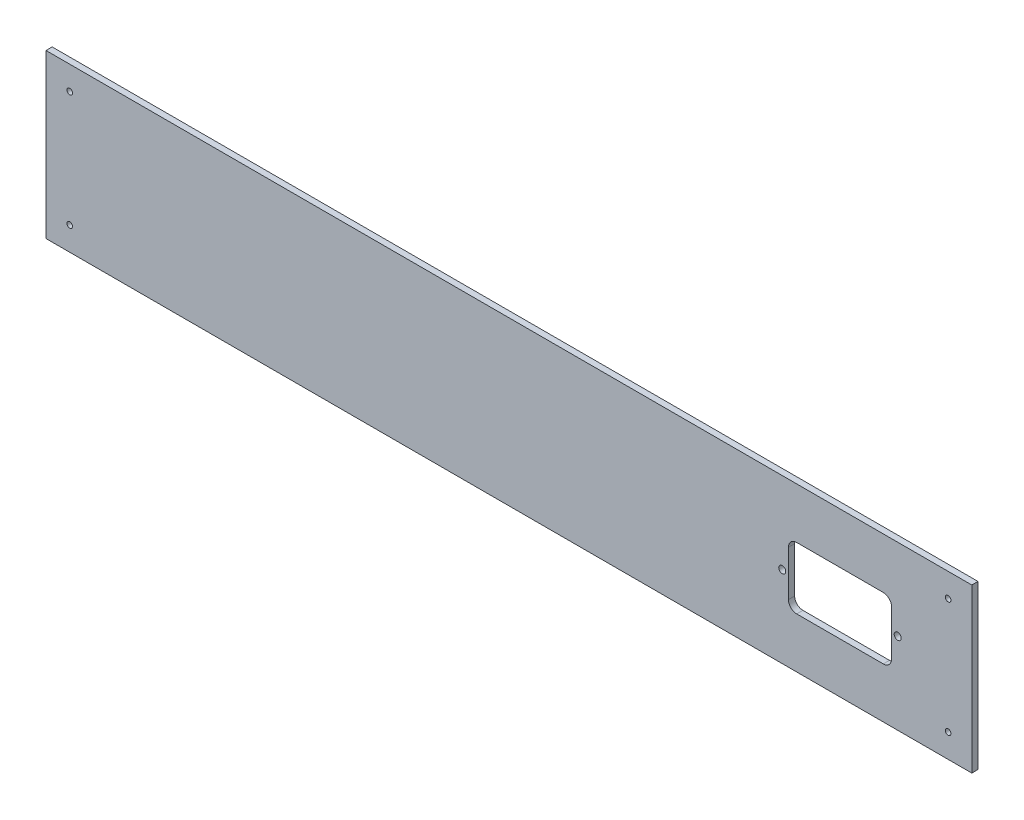
ISO-10303-21;
HEADER;
FILE_DESCRIPTION(('STEP AP214'),'2;1');
FILE_NAME('part.step','',(''),(''),'','','');
FILE_SCHEMA(('AUTOMOTIVE_DESIGN { 1 0 10303 214 1 1 1 1 }'));
ENDSEC;
DATA;
#1=APPLICATION_CONTEXT('core data for automotive mechanical design processes');
#2=APPLICATION_PROTOCOL_DEFINITION('international standard','automotive_design',2000,#1);
#3=PRODUCT_CONTEXT('',#1,'mechanical');
#4=PRODUCT('Part','Part','',(#3));
#5=PRODUCT_RELATED_PRODUCT_CATEGORY('part','',(#4));
#6=PRODUCT_DEFINITION_FORMATION('','',#4);
#7=PRODUCT_DEFINITION_CONTEXT('part definition',#1,'design');
#8=PRODUCT_DEFINITION('design','',#6,#7);
#9=PRODUCT_DEFINITION_SHAPE('','',#8);
#10=(LENGTH_UNIT() NAMED_UNIT(*) SI_UNIT(.MILLI.,.METRE.));
#11=(NAMED_UNIT(*) PLANE_ANGLE_UNIT() SI_UNIT($,.RADIAN.));
#12=(NAMED_UNIT(*) SI_UNIT($,.STERADIAN.) SOLID_ANGLE_UNIT());
#13=UNCERTAINTY_MEASURE_WITH_UNIT(LENGTH_MEASURE(1.E-05),#10,'distance_accuracy_value','');
#14=(GEOMETRIC_REPRESENTATION_CONTEXT(3) GLOBAL_UNCERTAINTY_ASSIGNED_CONTEXT((#13)) GLOBAL_UNIT_ASSIGNED_CONTEXT((#10,
#11,#12)) REPRESENTATION_CONTEXT('',''));
#15=CARTESIAN_POINT('',(0.,0.,0.));
#16=DIRECTION('',(0.,0.,1.));
#17=DIRECTION('',(1.,0.,0.));
#18=AXIS2_PLACEMENT_3D('',#15,#16,#17);
#19=CARTESIAN_POINT('',(0.,0.,3.));
#20=DIRECTION('',(0.,0.,-1.));
#21=DIRECTION('',(-1.,0.,0.));
#22=AXIS2_PLACEMENT_3D('',#19,#20,#21);
#23=PLANE('',#22);
#24=CARTESIAN_POINT('',(357.061242297895,39.5055064167184,3.));
#25=DIRECTION('',(0.,0.,-1.));
#26=DIRECTION('',(-1.,0.,0.));
#27=AXIS2_PLACEMENT_3D('',#24,#25,#26);
#28=CIRCLE('',#27,1.70000000000001);
#29=CARTESIAN_POINT('',(355.361242297895,39.5055064167184,3.));
#30=VERTEX_POINT('',#29);
#31=EDGE_CURVE('E356',#30,#30,#28,.T.);
#32=ORIENTED_EDGE('',*,*,#31,.T.);
#33=EDGE_LOOP('',(#32));
#34=FACE_BOUND('',#33,.T.);
#35=CARTESIAN_POINT('',(413.061242297895,39.5055064167184,3.));
#36=DIRECTION('',(0.,0.,-1.));
#37=DIRECTION('',(-1.,0.,0.));
#38=AXIS2_PLACEMENT_3D('',#35,#36,#37);
#39=CIRCLE('',#38,1.70000000000001);
#40=CARTESIAN_POINT('',(411.361242297895,39.5055064167184,3.));
#41=VERTEX_POINT('',#40);
#42=EDGE_CURVE('E166',#41,#41,#39,.T.);
#43=ORIENTED_EDGE('',*,*,#42,.T.);
#44=EDGE_LOOP('',(#43));
#45=FACE_BOUND('',#44,.T.);
#46=DIRECTION('',(0.,1.,0.));
#47=VECTOR('',#46,1.);
#48=CARTESIAN_POINT('',(360.074633799863,50.3949202589218,3.));
#49=LINE('',#48,#47);
#50=CARTESIAN_POINT('',(360.074633799863,28.3949202589218,3.));
#51=VERTEX_POINT('',#50);
#52=CARTESIAN_POINT('',(360.074633799863,50.3949202589218,3.));
#53=VERTEX_POINT('',#52);
#54=EDGE_CURVE('E132',#51,#53,#49,.T.);
#55=ORIENTED_EDGE('',*,*,#54,.T.);
#56=CARTESIAN_POINT('',(364.074633799863,50.3949202589218,3.));
#57=DIRECTION('',(0.,0.,-1.));
#58=DIRECTION('',(-1.,0.,0.));
#59=AXIS2_PLACEMENT_3D('',#56,#57,#58);
#60=CIRCLE('',#59,4.);
#61=CARTESIAN_POINT('',(364.074633799863,54.3949202589218,3.));
#62=VERTEX_POINT('',#61);
#63=EDGE_CURVE('E126',#53,#62,#60,.T.);
#64=ORIENTED_EDGE('',*,*,#63,.T.);
#65=DIRECTION('',(1.,0.,0.));
#66=VECTOR('',#65,1.);
#67=CARTESIAN_POINT('',(364.074633799863,54.3949202589218,3.));
#68=LINE('',#67,#66);
#69=CARTESIAN_POINT('',(406.074633799864,54.3949202589218,3.));
#70=VERTEX_POINT('',#69);
#71=EDGE_CURVE('E135',#62,#70,#68,.T.);
#72=ORIENTED_EDGE('',*,*,#71,.T.);
#73=CARTESIAN_POINT('',(406.074633799864,50.3949202589218,3.));
#74=DIRECTION('',(0.,0.,-1.));
#75=DIRECTION('',(1.,0.,0.));
#76=AXIS2_PLACEMENT_3D('',#73,#74,#75);
#77=CIRCLE('',#76,4.);
#78=CARTESIAN_POINT('',(410.074633799864,50.3949202589218,3.));
#79=VERTEX_POINT('',#78);
#80=EDGE_CURVE('E50',#70,#79,#77,.T.);
#81=ORIENTED_EDGE('',*,*,#80,.T.);
#82=DIRECTION('',(0.,-1.,0.));
#83=VECTOR('',#82,1.);
#84=CARTESIAN_POINT('',(410.074633799864,50.3949202589218,3.));
#85=LINE('',#84,#83);
#86=CARTESIAN_POINT('',(410.074633799864,28.3949202589218,3.));
#87=VERTEX_POINT('',#86);
#88=EDGE_CURVE('E152',#79,#87,#85,.T.);
#89=ORIENTED_EDGE('',*,*,#88,.T.);
#90=CARTESIAN_POINT('',(406.074633799864,28.3949202589218,3.));
#91=DIRECTION('',(0.,0.,-1.));
#92=DIRECTION('',(1.,0.,0.));
#93=AXIS2_PLACEMENT_3D('',#90,#91,#92);
#94=CIRCLE('',#93,4.);
#95=CARTESIAN_POINT('',(406.074633799864,24.3949202589218,3.));
#96=VERTEX_POINT('',#95);
#97=EDGE_CURVE('E155',#87,#96,#94,.T.);
#98=ORIENTED_EDGE('',*,*,#97,.T.);
#99=DIRECTION('',(-1.,0.,0.));
#100=VECTOR('',#99,1.);
#101=CARTESIAN_POINT('',(364.074633799863,24.3949202589218,3.));
#102=LINE('',#101,#100);
#103=CARTESIAN_POINT('',(364.074633799863,24.3949202589218,3.));
#104=VERTEX_POINT('',#103);
#105=EDGE_CURVE('E158',#96,#104,#102,.T.);
#106=ORIENTED_EDGE('',*,*,#105,.T.);
#107=CARTESIAN_POINT('',(364.074633799863,28.3949202589218,3.));
#108=DIRECTION('',(0.,0.,-1.));
#109=DIRECTION('',(1.,0.,0.));
#110=AXIS2_PLACEMENT_3D('',#107,#108,#109);
#111=CIRCLE('',#110,4.);
#112=EDGE_CURVE('E161',#104,#51,#111,.T.);
#113=ORIENTED_EDGE('',*,*,#112,.T.);
#114=EDGE_LOOP('',(#55,#64,#72,#81,#89,#98,#106,#113));
#115=FACE_BOUND('',#114,.T.);
#116=DIRECTION('',(1.,0.,0.));
#117=VECTOR('',#116,1.);
#118=CARTESIAN_POINT('',(449.,0.,3.));
#119=LINE('',#118,#117);
#120=CARTESIAN_POINT('',(0.,0.,3.));
#121=VERTEX_POINT('',#120);
#122=CARTESIAN_POINT('',(449.,0.,3.));
#123=VERTEX_POINT('',#122);
#124=EDGE_CURVE('E220',#121,#123,#119,.T.);
#125=ORIENTED_EDGE('',*,*,#124,.T.);
#126=DIRECTION('',(0.,1.,0.));
#127=VECTOR('',#126,1.);
#128=CARTESIAN_POINT('',(449.,79.,3.));
#129=LINE('',#128,#127);
#130=CARTESIAN_POINT('',(449.,79.,3.));
#131=VERTEX_POINT('',#130);
#132=EDGE_CURVE('E223',#123,#131,#129,.T.);
#133=ORIENTED_EDGE('',*,*,#132,.T.);
#134=DIRECTION('',(-1.,0.,0.));
#135=VECTOR('',#134,1.);
#136=CARTESIAN_POINT('',(0.,79.,3.));
#137=LINE('',#136,#135);
#138=CARTESIAN_POINT('',(0.,79.,3.));
#139=VERTEX_POINT('',#138);
#140=EDGE_CURVE('E226',#131,#139,#137,.T.);
#141=ORIENTED_EDGE('',*,*,#140,.T.);
#142=DIRECTION('',(0.,-1.,0.));
#143=VECTOR('',#142,1.);
#144=CARTESIAN_POINT('',(0.,0.,3.));
#145=LINE('',#144,#143);
#146=EDGE_CURVE('E228',#139,#121,#145,.T.);
#147=ORIENTED_EDGE('',*,*,#146,.T.);
#148=EDGE_LOOP('',(#125,#133,#141,#147));
#149=FACE_BOUND('',#148,.T.);
#150=CARTESIAN_POINT('',(11.5,67.5,3.));
#151=DIRECTION('',(0.,0.,1.));
#152=DIRECTION('',(1.,0.,0.));
#153=AXIS2_PLACEMENT_3D('',#150,#151,#152);
#154=CIRCLE('',#153,1.36166781672217);
#155=CARTESIAN_POINT('',(12.8616678167222,67.5,3.));
#156=VERTEX_POINT('',#155);
#157=EDGE_CURVE('E214',#156,#156,#154,.T.);
#158=ORIENTED_EDGE('',*,*,#157,.F.);
#159=EDGE_LOOP('',(#158));
#160=FACE_BOUND('',#159,.T.);
#161=CARTESIAN_POINT('',(437.5,67.5,3.));
#162=DIRECTION('',(0.,0.,1.));
#163=DIRECTION('',(-1.,0.,0.));
#164=AXIS2_PLACEMENT_3D('',#161,#162,#163);
#165=CIRCLE('',#164,1.36166781672212);
#166=CARTESIAN_POINT('',(436.138332183278,67.5,3.));
#167=VERTEX_POINT('',#166);
#168=EDGE_CURVE('E208',#167,#167,#165,.T.);
#169=ORIENTED_EDGE('',*,*,#168,.F.);
#170=EDGE_LOOP('',(#169));
#171=FACE_BOUND('',#170,.T.);
#172=CARTESIAN_POINT('',(11.5,11.5,3.));
#173=DIRECTION('',(0.,0.,1.));
#174=DIRECTION('',(-1.,0.,0.));
#175=AXIS2_PLACEMENT_3D('',#172,#173,#174);
#176=CIRCLE('',#175,1.36166781672217);
#177=CARTESIAN_POINT('',(10.1383321832778,11.5,3.));
#178=VERTEX_POINT('',#177);
#179=EDGE_CURVE('E202',#178,#178,#176,.T.);
#180=ORIENTED_EDGE('',*,*,#179,.F.);
#181=EDGE_LOOP('',(#180));
#182=FACE_BOUND('',#181,.T.);
#183=CARTESIAN_POINT('',(437.5,11.5,3.));
#184=DIRECTION('',(0.,0.,1.));
#185=DIRECTION('',(1.,0.,0.));
#186=AXIS2_PLACEMENT_3D('',#183,#184,#185);
#187=CIRCLE('',#186,1.36166781672212);
#188=CARTESIAN_POINT('',(438.861667816722,11.5,3.));
#189=VERTEX_POINT('',#188);
#190=EDGE_CURVE('E196',#189,#189,#187,.T.);
#191=ORIENTED_EDGE('',*,*,#190,.F.);
#192=EDGE_LOOP('',(#191));
#193=FACE_BOUND('',#192,.T.);
#194=ADVANCED_FACE('F35',(#34,#45,#115,#149,#160,#171,#182,#193),#23,.F.);
#195=CARTESIAN_POINT('',(0.,0.,0.));
#196=DIRECTION('',(0.,0.,-1.));
#197=DIRECTION('',(-1.,0.,0.));
#198=AXIS2_PLACEMENT_3D('',#195,#196,#197);
#199=PLANE('',#198);
#200=CARTESIAN_POINT('',(357.061242297895,39.5055064167184,0.));
#201=DIRECTION('',(0.,0.,-1.));
#202=DIRECTION('',(-1.,0.,0.));
#203=AXIS2_PLACEMENT_3D('',#200,#201,#202);
#204=CIRCLE('',#203,1.70000000000001);
#205=CARTESIAN_POINT('',(355.361242297895,39.5055064167184,0.));
#206=VERTEX_POINT('',#205);
#207=EDGE_CURVE('E359',#206,#206,#204,.T.);
#208=ORIENTED_EDGE('',*,*,#207,.F.);
#209=EDGE_LOOP('',(#208));
#210=FACE_BOUND('',#209,.T.);
#211=CARTESIAN_POINT('',(413.061242297895,39.5055064167184,0.));
#212=DIRECTION('',(0.,0.,-1.));
#213=DIRECTION('',(-1.,0.,0.));
#214=AXIS2_PLACEMENT_3D('',#211,#212,#213);
#215=CIRCLE('',#214,1.70000000000001);
#216=CARTESIAN_POINT('',(411.361242297895,39.5055064167184,0.));
#217=VERTEX_POINT('',#216);
#218=EDGE_CURVE('E148',#217,#217,#215,.T.);
#219=ORIENTED_EDGE('',*,*,#218,.F.);
#220=EDGE_LOOP('',(#219));
#221=FACE_BOUND('',#220,.T.);
#222=CARTESIAN_POINT('',(364.074633799863,50.3949202589218,0.));
#223=DIRECTION('',(0.,0.,-1.));
#224=DIRECTION('',(-1.,0.,0.));
#225=AXIS2_PLACEMENT_3D('',#222,#223,#224);
#226=CIRCLE('',#225,4.);
#227=CARTESIAN_POINT('',(360.074633799863,50.3949202589218,0.));
#228=VERTEX_POINT('',#227);
#229=CARTESIAN_POINT('',(364.074633799863,54.3949202589218,0.));
#230=VERTEX_POINT('',#229);
#231=EDGE_CURVE('E58',#228,#230,#226,.T.);
#232=ORIENTED_EDGE('',*,*,#231,.F.);
#233=DIRECTION('',(0.,1.,0.));
#234=VECTOR('',#233,1.);
#235=CARTESIAN_POINT('',(360.074633799863,50.3949202589218,0.));
#236=LINE('',#235,#234);
#237=CARTESIAN_POINT('',(360.074633799863,28.3949202589218,0.));
#238=VERTEX_POINT('',#237);
#239=EDGE_CURVE('E142',#238,#228,#236,.T.);
#240=ORIENTED_EDGE('',*,*,#239,.F.);
#241=CARTESIAN_POINT('',(364.074633799863,28.3949202589218,0.));
#242=DIRECTION('',(0.,0.,-1.));
#243=DIRECTION('',(1.,0.,0.));
#244=AXIS2_PLACEMENT_3D('',#241,#242,#243);
#245=CIRCLE('',#244,4.);
#246=CARTESIAN_POINT('',(364.074633799863,24.3949202589218,0.));
#247=VERTEX_POINT('',#246);
#248=EDGE_CURVE('E145',#247,#238,#245,.T.);
#249=ORIENTED_EDGE('',*,*,#248,.F.);
#250=DIRECTION('',(-1.,0.,0.));
#251=VECTOR('',#250,1.);
#252=CARTESIAN_POINT('',(364.074633799863,24.3949202589218,0.));
#253=LINE('',#252,#251);
#254=CARTESIAN_POINT('',(406.074633799864,24.3949202589218,0.));
#255=VERTEX_POINT('',#254);
#256=EDGE_CURVE('E177',#255,#247,#253,.T.);
#257=ORIENTED_EDGE('',*,*,#256,.F.);
#258=CARTESIAN_POINT('',(406.074633799864,28.3949202589218,0.));
#259=DIRECTION('',(0.,0.,-1.));
#260=DIRECTION('',(1.,0.,0.));
#261=AXIS2_PLACEMENT_3D('',#258,#259,#260);
#262=CIRCLE('',#261,4.);
#263=CARTESIAN_POINT('',(410.074633799864,28.3949202589218,0.));
#264=VERTEX_POINT('',#263);
#265=EDGE_CURVE('E174',#264,#255,#262,.T.);
#266=ORIENTED_EDGE('',*,*,#265,.F.);
#267=DIRECTION('',(0.,-1.,0.));
#268=VECTOR('',#267,1.);
#269=CARTESIAN_POINT('',(410.074633799864,50.3949202589218,0.));
#270=LINE('',#269,#268);
#271=CARTESIAN_POINT('',(410.074633799864,50.3949202589218,0.));
#272=VERTEX_POINT('',#271);
#273=EDGE_CURVE('E171',#272,#264,#270,.T.);
#274=ORIENTED_EDGE('',*,*,#273,.F.);
#275=CARTESIAN_POINT('',(406.074633799864,50.3949202589218,0.));
#276=DIRECTION('',(0.,0.,-1.));
#277=DIRECTION('',(1.,0.,0.));
#278=AXIS2_PLACEMENT_3D('',#275,#276,#277);
#279=CIRCLE('',#278,4.);
#280=CARTESIAN_POINT('',(406.074633799864,54.3949202589218,0.));
#281=VERTEX_POINT('',#280);
#282=EDGE_CURVE('E168',#281,#272,#279,.T.);
#283=ORIENTED_EDGE('',*,*,#282,.F.);
#284=DIRECTION('',(1.,0.,0.));
#285=VECTOR('',#284,1.);
#286=CARTESIAN_POINT('',(364.074633799863,54.3949202589218,0.));
#287=LINE('',#286,#285);
#288=EDGE_CURVE('E165',#230,#281,#287,.T.);
#289=ORIENTED_EDGE('',*,*,#288,.F.);
#290=EDGE_LOOP('',(#232,#240,#249,#257,#266,#274,#283,#289));
#291=FACE_BOUND('',#290,.T.);
#292=CARTESIAN_POINT('',(11.5,11.5,0.));
#293=DIRECTION('',(0.,0.,1.));
#294=DIRECTION('',(-1.,0.,0.));
#295=AXIS2_PLACEMENT_3D('',#292,#293,#294);
#296=CIRCLE('',#295,1.36166781672217);
#297=CARTESIAN_POINT('',(10.1383321832778,11.5,0.));
#298=VERTEX_POINT('',#297);
#299=EDGE_CURVE('E199',#298,#298,#296,.T.);
#300=ORIENTED_EDGE('',*,*,#299,.T.);
#301=EDGE_LOOP('',(#300));
#302=FACE_BOUND('',#301,.T.);
#303=CARTESIAN_POINT('',(11.5,67.5,0.));
#304=DIRECTION('',(0.,0.,1.));
#305=DIRECTION('',(1.,0.,0.));
#306=AXIS2_PLACEMENT_3D('',#303,#304,#305);
#307=CIRCLE('',#306,1.36166781672217);
#308=CARTESIAN_POINT('',(12.8616678167222,67.5,0.));
#309=VERTEX_POINT('',#308);
#310=EDGE_CURVE('E211',#309,#309,#307,.T.);
#311=ORIENTED_EDGE('',*,*,#310,.T.);
#312=EDGE_LOOP('',(#311));
#313=FACE_BOUND('',#312,.T.);
#314=DIRECTION('',(1.,0.,0.));
#315=VECTOR('',#314,1.);
#316=CARTESIAN_POINT('',(449.,0.,0.));
#317=LINE('',#316,#315);
#318=CARTESIAN_POINT('',(0.,0.,0.));
#319=VERTEX_POINT('',#318);
#320=CARTESIAN_POINT('',(449.,0.,0.));
#321=VERTEX_POINT('',#320);
#322=EDGE_CURVE('E217',#319,#321,#317,.T.);
#323=ORIENTED_EDGE('',*,*,#322,.F.);
#324=DIRECTION('',(0.,-1.,0.));
#325=VECTOR('',#324,1.);
#326=CARTESIAN_POINT('',(0.,0.,0.));
#327=LINE('',#326,#325);
#328=CARTESIAN_POINT('',(0.,79.,0.));
#329=VERTEX_POINT('',#328);
#330=EDGE_CURVE('E224',#329,#319,#327,.T.);
#331=ORIENTED_EDGE('',*,*,#330,.F.);
#332=DIRECTION('',(-1.,0.,0.));
#333=VECTOR('',#332,1.);
#334=CARTESIAN_POINT('',(0.,79.,0.));
#335=LINE('',#334,#333);
#336=CARTESIAN_POINT('',(449.,79.,0.));
#337=VERTEX_POINT('',#336);
#338=EDGE_CURVE('E235',#337,#329,#335,.T.);
#339=ORIENTED_EDGE('',*,*,#338,.F.);
#340=DIRECTION('',(0.,1.,0.));
#341=VECTOR('',#340,1.);
#342=CARTESIAN_POINT('',(449.,79.,0.));
#343=LINE('',#342,#341);
#344=EDGE_CURVE('E233',#321,#337,#343,.T.);
#345=ORIENTED_EDGE('',*,*,#344,.F.);
#346=EDGE_LOOP('',(#323,#331,#339,#345));
#347=FACE_BOUND('',#346,.T.);
#348=CARTESIAN_POINT('',(437.5,67.5,0.));
#349=DIRECTION('',(0.,0.,1.));
#350=DIRECTION('',(-1.,0.,0.));
#351=AXIS2_PLACEMENT_3D('',#348,#349,#350);
#352=CIRCLE('',#351,1.36166781672212);
#353=CARTESIAN_POINT('',(436.138332183278,67.5,0.));
#354=VERTEX_POINT('',#353);
#355=EDGE_CURVE('E205',#354,#354,#352,.T.);
#356=ORIENTED_EDGE('',*,*,#355,.T.);
#357=EDGE_LOOP('',(#356));
#358=FACE_BOUND('',#357,.T.);
#359=CARTESIAN_POINT('',(437.5,11.5,0.));
#360=DIRECTION('',(0.,0.,1.));
#361=DIRECTION('',(1.,0.,0.));
#362=AXIS2_PLACEMENT_3D('',#359,#360,#361);
#363=CIRCLE('',#362,1.36166781672212);
#364=CARTESIAN_POINT('',(438.861667816722,11.5,0.));
#365=VERTEX_POINT('',#364);
#366=EDGE_CURVE('E184',#365,#365,#363,.T.);
#367=ORIENTED_EDGE('',*,*,#366,.T.);
#368=EDGE_LOOP('',(#367));
#369=FACE_BOUND('',#368,.T.);
#370=ADVANCED_FACE('F253',(#210,#221,#291,#302,#313,#347,#358,#369),#199,.T.);
#371=CARTESIAN_POINT('',(449.,0.,3.));
#372=DIRECTION('',(0.,1.,0.));
#373=DIRECTION('',(-1.,0.,0.));
#374=AXIS2_PLACEMENT_3D('',#371,#372,#373);
#375=PLANE('',#374);
#376=ORIENTED_EDGE('',*,*,#322,.T.);
#377=DIRECTION('',(0.,0.,-1.));
#378=VECTOR('',#377,1.);
#379=CARTESIAN_POINT('',(449.,0.,3.));
#380=LINE('',#379,#378);
#381=EDGE_CURVE('E11',#123,#321,#380,.T.);
#382=ORIENTED_EDGE('',*,*,#381,.F.);
#383=ORIENTED_EDGE('',*,*,#124,.F.);
#384=DIRECTION('',(0.,0.,-1.));
#385=VECTOR('',#384,1.);
#386=CARTESIAN_POINT('',(0.,0.,3.));
#387=LINE('',#386,#385);
#388=EDGE_CURVE('E230',#121,#319,#387,.T.);
#389=ORIENTED_EDGE('',*,*,#388,.T.);
#390=EDGE_LOOP('',(#376,#382,#383,#389));
#391=FACE_BOUND('',#390,.T.);
#392=ADVANCED_FACE('F37',(#391),#375,.F.);
#393=CARTESIAN_POINT('',(449.,79.,3.));
#394=DIRECTION('',(-1.,0.,0.));
#395=DIRECTION('',(0.,0.,1.));
#396=AXIS2_PLACEMENT_3D('',#393,#394,#395);
#397=PLANE('',#396);
#398=ORIENTED_EDGE('',*,*,#344,.T.);
#399=DIRECTION('',(0.,0.,-1.));
#400=VECTOR('',#399,1.);
#401=CARTESIAN_POINT('',(449.,79.,3.));
#402=LINE('',#401,#400);
#403=EDGE_CURVE('E43',#131,#337,#402,.T.);
#404=ORIENTED_EDGE('',*,*,#403,.F.);
#405=ORIENTED_EDGE('',*,*,#132,.F.);
#406=ORIENTED_EDGE('',*,*,#381,.T.);
#407=EDGE_LOOP('',(#398,#404,#405,#406));
#408=FACE_BOUND('',#407,.T.);
#409=ADVANCED_FACE('F263',(#408),#397,.F.);
#410=CARTESIAN_POINT('',(0.,79.,3.));
#411=DIRECTION('',(0.,-1.,0.));
#412=DIRECTION('',(0.,0.,-1.));
#413=AXIS2_PLACEMENT_3D('',#410,#411,#412);
#414=PLANE('',#413);
#415=ORIENTED_EDGE('',*,*,#338,.T.);
#416=DIRECTION('',(0.,0.,-1.));
#417=VECTOR('',#416,1.);
#418=CARTESIAN_POINT('',(0.,79.,3.));
#419=LINE('',#418,#417);
#420=EDGE_CURVE('E240',#139,#329,#419,.T.);
#421=ORIENTED_EDGE('',*,*,#420,.F.);
#422=ORIENTED_EDGE('',*,*,#140,.F.);
#423=ORIENTED_EDGE('',*,*,#403,.T.);
#424=EDGE_LOOP('',(#415,#421,#422,#423));
#425=FACE_BOUND('',#424,.T.);
#426=ADVANCED_FACE('F247',(#425),#414,.F.);
#427=CARTESIAN_POINT('',(0.,0.,3.));
#428=DIRECTION('',(1.,0.,0.));
#429=DIRECTION('',(0.,1.,0.));
#430=AXIS2_PLACEMENT_3D('',#427,#428,#429);
#431=PLANE('',#430);
#432=ORIENTED_EDGE('',*,*,#330,.T.);
#433=ORIENTED_EDGE('',*,*,#388,.F.);
#434=ORIENTED_EDGE('',*,*,#146,.F.);
#435=ORIENTED_EDGE('',*,*,#420,.T.);
#436=EDGE_LOOP('',(#432,#433,#434,#435));
#437=FACE_BOUND('',#436,.T.);
#438=ADVANCED_FACE('F257',(#437),#431,.F.);
#439=CARTESIAN_POINT('',(11.5,67.5,3.));
#440=DIRECTION('',(0.,0.,-1.));
#441=DIRECTION('',(-1.,0.,0.));
#442=AXIS2_PLACEMENT_3D('',#439,#440,#441);
#443=CYLINDRICAL_SURFACE('',#442,1.36166781672217);
#444=ORIENTED_EDGE('',*,*,#157,.T.);
#445=EDGE_LOOP('',(#444));
#446=FACE_BOUND('',#445,.T.);
#447=ORIENTED_EDGE('',*,*,#310,.F.);
#448=EDGE_LOOP('',(#447));
#449=FACE_BOUND('',#448,.T.);
#450=ADVANCED_FACE('F281',(#446,#449),#443,.F.);
#451=CARTESIAN_POINT('',(437.5,67.5,3.));
#452=DIRECTION('',(0.,0.,-1.));
#453=DIRECTION('',(-1.,0.,0.));
#454=AXIS2_PLACEMENT_3D('',#451,#452,#453);
#455=CYLINDRICAL_SURFACE('',#454,1.36166781672212);
#456=ORIENTED_EDGE('',*,*,#168,.T.);
#457=EDGE_LOOP('',(#456));
#458=FACE_BOUND('',#457,.T.);
#459=ORIENTED_EDGE('',*,*,#355,.F.);
#460=EDGE_LOOP('',(#459));
#461=FACE_BOUND('',#460,.T.);
#462=ADVANCED_FACE('F288',(#458,#461),#455,.F.);
#463=CARTESIAN_POINT('',(11.5,11.5,3.));
#464=DIRECTION('',(0.,0.,-1.));
#465=DIRECTION('',(-1.,0.,0.));
#466=AXIS2_PLACEMENT_3D('',#463,#464,#465);
#467=CYLINDRICAL_SURFACE('',#466,1.36166781672217);
#468=ORIENTED_EDGE('',*,*,#179,.T.);
#469=EDGE_LOOP('',(#468));
#470=FACE_BOUND('',#469,.T.);
#471=ORIENTED_EDGE('',*,*,#299,.F.);
#472=EDGE_LOOP('',(#471));
#473=FACE_BOUND('',#472,.T.);
#474=ADVANCED_FACE('F293',(#470,#473),#467,.F.);
#475=CARTESIAN_POINT('',(437.5,11.5,3.));
#476=DIRECTION('',(0.,0.,-1.));
#477=DIRECTION('',(-1.,0.,0.));
#478=AXIS2_PLACEMENT_3D('',#475,#476,#477);
#479=CYLINDRICAL_SURFACE('',#478,1.36166781672212);
#480=ORIENTED_EDGE('',*,*,#190,.T.);
#481=EDGE_LOOP('',(#480));
#482=FACE_BOUND('',#481,.T.);
#483=ORIENTED_EDGE('',*,*,#366,.F.);
#484=EDGE_LOOP('',(#483));
#485=FACE_BOUND('',#484,.T.);
#486=ADVANCED_FACE('F306',(#482,#485),#479,.F.);
#487=CARTESIAN_POINT('',(364.074633799863,50.3949202589218,3.));
#488=DIRECTION('',(0.,0.,-1.));
#489=DIRECTION('',(-1.,0.,0.));
#490=AXIS2_PLACEMENT_3D('',#487,#488,#489);
#491=CYLINDRICAL_SURFACE('',#490,4.);
#492=ORIENTED_EDGE('',*,*,#231,.T.);
#493=DIRECTION('',(0.,0.,-1.));
#494=VECTOR('',#493,1.);
#495=CARTESIAN_POINT('',(364.074633799863,54.3949202589218,3.));
#496=LINE('',#495,#494);
#497=EDGE_CURVE('E122',#62,#230,#496,.T.);
#498=ORIENTED_EDGE('',*,*,#497,.F.);
#499=ORIENTED_EDGE('',*,*,#63,.F.);
#500=DIRECTION('',(0.,0.,-1.));
#501=VECTOR('',#500,1.);
#502=CARTESIAN_POINT('',(360.074633799863,50.3949202589218,3.));
#503=LINE('',#502,#501);
#504=EDGE_CURVE('E182',#53,#228,#503,.T.);
#505=ORIENTED_EDGE('',*,*,#504,.T.);
#506=EDGE_LOOP('',(#492,#498,#499,#505));
#507=FACE_BOUND('',#506,.T.);
#508=ADVANCED_FACE('F124',(#507),#491,.F.);
#509=CARTESIAN_POINT('',(360.074633799863,50.3949202589218,3.));
#510=DIRECTION('',(-1.,0.,0.));
#511=DIRECTION('',(0.,0.,1.));
#512=AXIS2_PLACEMENT_3D('',#509,#510,#511);
#513=PLANE('',#512);
#514=ORIENTED_EDGE('',*,*,#239,.T.);
#515=ORIENTED_EDGE('',*,*,#504,.F.);
#516=ORIENTED_EDGE('',*,*,#54,.F.);
#517=DIRECTION('',(0.,0.,-1.));
#518=VECTOR('',#517,1.);
#519=CARTESIAN_POINT('',(360.074633799863,28.3949202589218,3.));
#520=LINE('',#519,#518);
#521=EDGE_CURVE('E185',#51,#238,#520,.T.);
#522=ORIENTED_EDGE('',*,*,#521,.T.);
#523=EDGE_LOOP('',(#514,#515,#516,#522));
#524=FACE_BOUND('',#523,.T.);
#525=ADVANCED_FACE('F316',(#524),#513,.F.);
#526=CARTESIAN_POINT('',(364.074633799863,28.3949202589218,3.));
#527=DIRECTION('',(0.,0.,-1.));
#528=DIRECTION('',(-1.,0.,0.));
#529=AXIS2_PLACEMENT_3D('',#526,#527,#528);
#530=CYLINDRICAL_SURFACE('',#529,4.);
#531=ORIENTED_EDGE('',*,*,#248,.T.);
#532=ORIENTED_EDGE('',*,*,#521,.F.);
#533=ORIENTED_EDGE('',*,*,#112,.F.);
#534=DIRECTION('',(0.,0.,-1.));
#535=VECTOR('',#534,1.);
#536=CARTESIAN_POINT('',(364.074633799863,24.3949202589218,3.));
#537=LINE('',#536,#535);
#538=EDGE_CURVE('E187',#104,#247,#537,.T.);
#539=ORIENTED_EDGE('',*,*,#538,.T.);
#540=EDGE_LOOP('',(#531,#532,#533,#539));
#541=FACE_BOUND('',#540,.T.);
#542=ADVANCED_FACE('F338',(#541),#530,.F.);
#543=CARTESIAN_POINT('',(364.074633799863,24.3949202589218,3.));
#544=DIRECTION('',(0.,-1.,0.));
#545=DIRECTION('',(1.,0.,0.));
#546=AXIS2_PLACEMENT_3D('',#543,#544,#545);
#547=PLANE('',#546);
#548=ORIENTED_EDGE('',*,*,#256,.T.);
#549=ORIENTED_EDGE('',*,*,#538,.F.);
#550=ORIENTED_EDGE('',*,*,#105,.F.);
#551=DIRECTION('',(0.,0.,-1.));
#552=VECTOR('',#551,1.);
#553=CARTESIAN_POINT('',(406.074633799864,24.3949202589218,3.));
#554=LINE('',#553,#552);
#555=EDGE_CURVE('E189',#96,#255,#554,.T.);
#556=ORIENTED_EDGE('',*,*,#555,.T.);
#557=EDGE_LOOP('',(#548,#549,#550,#556));
#558=FACE_BOUND('',#557,.T.);
#559=ADVANCED_FACE('F334',(#558),#547,.F.);
#560=CARTESIAN_POINT('',(406.074633799864,28.3949202589218,3.));
#561=DIRECTION('',(0.,0.,-1.));
#562=DIRECTION('',(-1.,0.,0.));
#563=AXIS2_PLACEMENT_3D('',#560,#561,#562);
#564=CYLINDRICAL_SURFACE('',#563,4.);
#565=ORIENTED_EDGE('',*,*,#265,.T.);
#566=ORIENTED_EDGE('',*,*,#555,.F.);
#567=ORIENTED_EDGE('',*,*,#97,.F.);
#568=DIRECTION('',(0.,0.,-1.));
#569=VECTOR('',#568,1.);
#570=CARTESIAN_POINT('',(410.074633799864,28.3949202589218,3.));
#571=LINE('',#570,#569);
#572=EDGE_CURVE('E191',#87,#264,#571,.T.);
#573=ORIENTED_EDGE('',*,*,#572,.T.);
#574=EDGE_LOOP('',(#565,#566,#567,#573));
#575=FACE_BOUND('',#574,.T.);
#576=ADVANCED_FACE('F330',(#575),#564,.F.);
#577=CARTESIAN_POINT('',(410.074633799864,50.3949202589218,3.));
#578=DIRECTION('',(1.,0.,0.));
#579=DIRECTION('',(0.,0.,-1.));
#580=AXIS2_PLACEMENT_3D('',#577,#578,#579);
#581=PLANE('',#580);
#582=ORIENTED_EDGE('',*,*,#273,.T.);
#583=ORIENTED_EDGE('',*,*,#572,.F.);
#584=ORIENTED_EDGE('',*,*,#88,.F.);
#585=DIRECTION('',(0.,0.,-1.));
#586=VECTOR('',#585,1.);
#587=CARTESIAN_POINT('',(410.074633799864,50.3949202589218,3.));
#588=LINE('',#587,#586);
#589=EDGE_CURVE('E193',#79,#272,#588,.T.);
#590=ORIENTED_EDGE('',*,*,#589,.T.);
#591=EDGE_LOOP('',(#582,#583,#584,#590));
#592=FACE_BOUND('',#591,.T.);
#593=ADVANCED_FACE('F327',(#592),#581,.F.);
#594=CARTESIAN_POINT('',(406.074633799864,50.3949202589218,3.));
#595=DIRECTION('',(0.,0.,-1.));
#596=DIRECTION('',(-1.,0.,0.));
#597=AXIS2_PLACEMENT_3D('',#594,#595,#596);
#598=CYLINDRICAL_SURFACE('',#597,4.);
#599=ORIENTED_EDGE('',*,*,#282,.T.);
#600=ORIENTED_EDGE('',*,*,#589,.F.);
#601=ORIENTED_EDGE('',*,*,#80,.F.);
#602=DIRECTION('',(0.,0.,-1.));
#603=VECTOR('',#602,1.);
#604=CARTESIAN_POINT('',(406.074633799864,54.3949202589218,3.));
#605=LINE('',#604,#603);
#606=EDGE_CURVE('E131',#70,#281,#605,.T.);
#607=ORIENTED_EDGE('',*,*,#606,.T.);
#608=EDGE_LOOP('',(#599,#600,#601,#607));
#609=FACE_BOUND('',#608,.T.);
#610=ADVANCED_FACE('F324',(#609),#598,.F.);
#611=CARTESIAN_POINT('',(364.074633799863,54.3949202589218,3.));
#612=DIRECTION('',(0.,1.,0.));
#613=DIRECTION('',(-1.,0.,0.));
#614=AXIS2_PLACEMENT_3D('',#611,#612,#613);
#615=PLANE('',#614);
#616=ORIENTED_EDGE('',*,*,#288,.T.);
#617=ORIENTED_EDGE('',*,*,#606,.F.);
#618=ORIENTED_EDGE('',*,*,#71,.F.);
#619=ORIENTED_EDGE('',*,*,#497,.T.);
#620=EDGE_LOOP('',(#616,#617,#618,#619));
#621=FACE_BOUND('',#620,.T.);
#622=ADVANCED_FACE('F136',(#621),#615,.F.);
#623=CARTESIAN_POINT('',(413.061242297895,39.5055064167184,3.));
#624=DIRECTION('',(0.,0.,-1.));
#625=DIRECTION('',(-1.,0.,0.));
#626=AXIS2_PLACEMENT_3D('',#623,#624,#625);
#627=CYLINDRICAL_SURFACE('',#626,1.70000000000001);
#628=ORIENTED_EDGE('',*,*,#42,.F.);
#629=EDGE_LOOP('',(#628));
#630=FACE_BOUND('',#629,.T.);
#631=ORIENTED_EDGE('',*,*,#218,.T.);
#632=EDGE_LOOP('',(#631));
#633=FACE_BOUND('',#632,.T.);
#634=ADVANCED_FACE('F323',(#630,#633),#627,.F.);
#635=CARTESIAN_POINT('',(357.061242297895,39.5055064167184,3.));
#636=DIRECTION('',(0.,0.,-1.));
#637=DIRECTION('',(-1.,0.,0.));
#638=AXIS2_PLACEMENT_3D('',#635,#636,#637);
#639=CYLINDRICAL_SURFACE('',#638,1.70000000000001);
#640=ORIENTED_EDGE('',*,*,#31,.F.);
#641=EDGE_LOOP('',(#640));
#642=FACE_BOUND('',#641,.T.);
#643=ORIENTED_EDGE('',*,*,#207,.T.);
#644=EDGE_LOOP('',(#643));
#645=FACE_BOUND('',#644,.T.);
#646=ADVANCED_FACE('F348',(#642,#645),#639,.F.);
#647=CLOSED_SHELL('',(#194,#370,#392,#409,#426,#438,#450,#462,#474,#486,#508,#525,#542,#559,
#576,#593,#610,#622,#634,#646));
#648=MANIFOLD_SOLID_BREP('B2',#647);
#649=ADVANCED_BREP_SHAPE_REPRESENTATION('',(#18,#648),#14);
#650=SHAPE_DEFINITION_REPRESENTATION(#9,#649);
ENDSEC;
END-ISO-10303-21;
